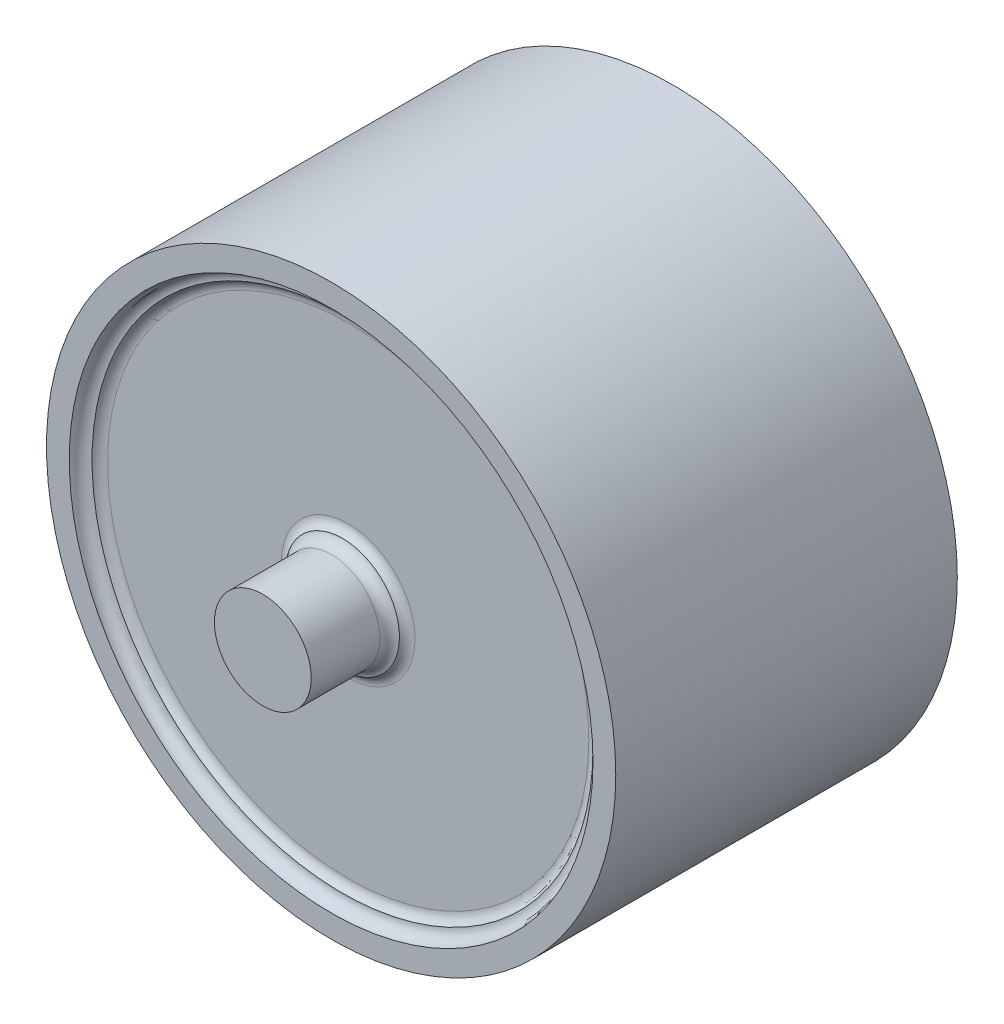
ISO-10303-21;
HEADER;
FILE_DESCRIPTION(('STEP AP214'),'2;1');
FILE_NAME('part.step','',(''),(''),'','','');
FILE_SCHEMA(('AUTOMOTIVE_DESIGN { 1 0 10303 214 1 1 1 1 }'));
ENDSEC;
DATA;
#1=APPLICATION_CONTEXT('core data for automotive mechanical design processes');
#2=APPLICATION_PROTOCOL_DEFINITION('international standard','automotive_design',2000,#1);
#3=PRODUCT_CONTEXT('',#1,'mechanical');
#4=PRODUCT('Part','Part','',(#3));
#5=PRODUCT_RELATED_PRODUCT_CATEGORY('part','',(#4));
#6=PRODUCT_DEFINITION_FORMATION('','',#4);
#7=PRODUCT_DEFINITION_CONTEXT('part definition',#1,'design');
#8=PRODUCT_DEFINITION('design','',#6,#7);
#9=PRODUCT_DEFINITION_SHAPE('','',#8);
#10=(LENGTH_UNIT() NAMED_UNIT(*) SI_UNIT(.MILLI.,.METRE.));
#11=(NAMED_UNIT(*) PLANE_ANGLE_UNIT() SI_UNIT($,.RADIAN.));
#12=(NAMED_UNIT(*) SI_UNIT($,.STERADIAN.) SOLID_ANGLE_UNIT());
#13=UNCERTAINTY_MEASURE_WITH_UNIT(LENGTH_MEASURE(1.E-05),#10,'distance_accuracy_value','');
#14=(GEOMETRIC_REPRESENTATION_CONTEXT(3) GLOBAL_UNCERTAINTY_ASSIGNED_CONTEXT((#13)) GLOBAL_UNIT_ASSIGNED_CONTEXT((#10,
#11,#12)) REPRESENTATION_CONTEXT('',''));
#15=CARTESIAN_POINT('',(0.,0.,0.));
#16=DIRECTION('',(0.,0.,1.));
#17=DIRECTION('',(1.,0.,0.));
#18=AXIS2_PLACEMENT_3D('',#15,#16,#17);
#19=CARTESIAN_POINT('',(0.,0.,-120.94205209168));
#20=DIRECTION('',(0.,0.,1.));
#21=DIRECTION('',(1.,0.,0.));
#22=AXIS2_PLACEMENT_3D('',#19,#20,#21);
#23=PLANE('',#22);
#24=CARTESIAN_POINT('',(0.,0.,-120.94205209168));
#25=DIRECTION('',(0.,0.,1.));
#26=DIRECTION('',(1.,0.,0.));
#27=AXIS2_PLACEMENT_3D('',#24,#25,#26);
#28=CIRCLE('',#27,200.);
#29=CARTESIAN_POINT('',(200.,0.,-120.94205209168));
#30=VERTEX_POINT('',#29);
#31=EDGE_CURVE('E60',#30,#30,#28,.T.);
#32=ORIENTED_EDGE('',*,*,#31,.F.);
#33=EDGE_LOOP('',(#32));
#34=FACE_BOUND('',#33,.T.);
#35=CARTESIAN_POINT('',(0.,0.,-120.94205209168));
#36=DIRECTION('',(0.,0.,1.));
#37=DIRECTION('',(1.,0.,0.));
#38=AXIS2_PLACEMENT_3D('',#35,#36,#37);
#39=CIRCLE('',#38,40.);
#40=CARTESIAN_POINT('',(40.,0.,-120.94205209168));
#41=VERTEX_POINT('',#40);
#42=EDGE_CURVE('E52',#41,#41,#39,.F.);
#43=ORIENTED_EDGE('',*,*,#42,.F.);
#44=EDGE_LOOP('',(#43));
#45=FACE_BOUND('',#44,.T.);
#46=ADVANCED_FACE('F40',(#34,#45),#23,.F.);
#47=CARTESIAN_POINT('',(0.,0.,107.05794790832));
#48=DIRECTION('',(0.,0.,1.));
#49=DIRECTION('',(1.,0.,0.));
#50=AXIS2_PLACEMENT_3D('',#47,#48,#49);
#51=PLANE('',#50);
#52=CARTESIAN_POINT('',(0.,0.,107.05794790832));
#53=DIRECTION('',(0.,0.,1.));
#54=DIRECTION('',(1.,0.,0.));
#55=AXIS2_PLACEMENT_3D('',#52,#53,#54);
#56=CIRCLE('',#55,46.9282032302755);
#57=CARTESIAN_POINT('',(46.9282032302755,0.,107.05794790832));
#58=VERTEX_POINT('',#57);
#59=EDGE_CURVE('E10',#58,#58,#56,.F.);
#60=ORIENTED_EDGE('',*,*,#59,.T.);
#61=EDGE_LOOP('',(#60));
#62=FACE_BOUND('',#61,.T.);
#63=CARTESIAN_POINT('',(0.,0.,107.05794790832));
#64=DIRECTION('',(0.,0.,1.));
#65=DIRECTION('',(1.,0.,0.));
#66=AXIS2_PLACEMENT_3D('',#63,#64,#65);
#67=CIRCLE('',#66,169.071796769725);
#68=CARTESIAN_POINT('',(169.071796769725,0.,107.05794790832));
#69=VERTEX_POINT('',#68);
#70=EDGE_CURVE('E57',#69,#69,#67,.T.);
#71=ORIENTED_EDGE('',*,*,#70,.T.);
#72=EDGE_LOOP('',(#71));
#73=FACE_BOUND('',#72,.T.);
#74=ADVANCED_FACE('F95',(#62,#73),#51,.T.);
#75=CARTESIAN_POINT('',(0.,0.,-120.94205209168));
#76=DIRECTION('',(0.,0.,1.));
#77=DIRECTION('',(1.,0.,0.));
#78=AXIS2_PLACEMENT_3D('',#75,#76,#77);
#79=CYLINDRICAL_SURFACE('',#78,200.);
#80=ORIENTED_EDGE('',*,*,#31,.T.);
#81=EDGE_LOOP('',(#80));
#82=FACE_BOUND('',#81,.T.);
#83=CARTESIAN_POINT('',(0.,0.,119.05794790832));
#84=DIRECTION('',(0.,0.,1.));
#85=DIRECTION('',(1.,0.,0.));
#86=AXIS2_PLACEMENT_3D('',#83,#84,#85);
#87=CIRCLE('',#86,200.);
#88=CARTESIAN_POINT('',(200.,0.,119.05794790832));
#89=VERTEX_POINT('',#88);
#90=EDGE_CURVE('E63',#89,#89,#87,.T.);
#91=ORIENTED_EDGE('',*,*,#90,.F.);
#92=EDGE_LOOP('',(#91));
#93=FACE_BOUND('',#92,.T.);
#94=ADVANCED_FACE('F101',(#82,#93),#79,.T.);
#95=CARTESIAN_POINT('',(0.,0.,119.05794790832));
#96=DIRECTION('',(0.,0.,1.));
#97=DIRECTION('',(1.,0.,0.));
#98=AXIS2_PLACEMENT_3D('',#95,#96,#97);
#99=PLANE('',#98);
#100=CARTESIAN_POINT('',(0.,0.,119.05794790832));
#101=DIRECTION('',(0.,0.,1.));
#102=DIRECTION('',(1.,0.,0.));
#103=AXIS2_PLACEMENT_3D('',#100,#101,#102);
#104=CIRCLE('',#103,184.);
#105=CARTESIAN_POINT('',(184.,0.,119.05794790832));
#106=VERTEX_POINT('',#105);
#107=EDGE_CURVE('E66',#106,#106,#104,.T.);
#108=ORIENTED_EDGE('',*,*,#107,.F.);
#109=EDGE_LOOP('',(#108));
#110=FACE_BOUND('',#109,.T.);
#111=ORIENTED_EDGE('',*,*,#90,.T.);
#112=EDGE_LOOP('',(#111));
#113=FACE_BOUND('',#112,.T.);
#114=ADVANCED_FACE('F107',(#110,#113),#99,.T.);
#115=CARTESIAN_POINT('',(0.,0.,119.05794790832));
#116=DIRECTION('',(0.,0.,1.));
#117=DIRECTION('',(1.,0.,0.));
#118=AXIS2_PLACEMENT_3D('',#115,#116,#117);
#119=TOROIDAL_SURFACE('',#118,176.,8.);
#120=ORIENTED_EDGE('',*,*,#107,.T.);
#121=EDGE_LOOP('',(#120));
#122=FACE_BOUND('',#121,.T.);
#123=CARTESIAN_POINT('',(0.,0.,111.05794790832));
#124=DIRECTION('',(0.,0.,1.));
#125=DIRECTION('',(1.,0.,0.));
#126=AXIS2_PLACEMENT_3D('',#123,#124,#125);
#127=CIRCLE('',#126,176.);
#128=CARTESIAN_POINT('',(176.,0.,111.05794790832));
#129=VERTEX_POINT('',#128);
#130=EDGE_CURVE('E69',#129,#129,#127,.T.);
#131=ORIENTED_EDGE('',*,*,#130,.F.);
#132=EDGE_LOOP('',(#131));
#133=FACE_BOUND('',#132,.T.);
#134=ADVANCED_FACE('F111',(#122,#133),#119,.F.);
#135=CARTESIAN_POINT('',(0.,0.,115.05794790832));
#136=DIRECTION('',(0.,0.,-1.));
#137=DIRECTION('',(-1.,0.,0.));
#138=AXIS2_PLACEMENT_3D('',#135,#136,#137);
#139=TOROIDAL_SURFACE('',#138,169.071796769725,8.);
#140=ORIENTED_EDGE('',*,*,#130,.T.);
#141=EDGE_LOOP('',(#140));
#142=FACE_BOUND('',#141,.T.);
#143=ORIENTED_EDGE('',*,*,#70,.F.);
#144=EDGE_LOOP('',(#143));
#145=FACE_BOUND('',#144,.T.);
#146=ADVANCED_FACE('F114',(#142,#145),#139,.F.);
#147=CARTESIAN_POINT('',(0.,0.,167.05794790832));
#148=DIRECTION('',(0.,0.,-1.));
#149=DIRECTION('',(-1.,0.,0.));
#150=AXIS2_PLACEMENT_3D('',#147,#148,#149);
#151=CYLINDRICAL_SURFACE('',#150,34.);
#152=CARTESIAN_POINT('',(0.,0.,118.803914600735));
#153=DIRECTION('',(0.,0.,-1.));
#154=DIRECTION('',(-1.,0.,0.));
#155=AXIS2_PLACEMENT_3D('',#152,#153,#154);
#156=CIRCLE('',#155,34.);
#157=CARTESIAN_POINT('',(-34.,0.,118.803914600735));
#158=VERTEX_POINT('',#157);
#159=EDGE_CURVE('E48',#158,#158,#156,.F.);
#160=ORIENTED_EDGE('',*,*,#159,.T.);
#161=EDGE_LOOP('',(#160));
#162=FACE_BOUND('',#161,.T.);
#163=CARTESIAN_POINT('',(0.,0.,167.05794790832));
#164=DIRECTION('',(0.,0.,1.));
#165=DIRECTION('',(1.,0.,0.));
#166=AXIS2_PLACEMENT_3D('',#163,#164,#165);
#167=CIRCLE('',#166,34.);
#168=CARTESIAN_POINT('',(34.,0.,167.05794790832));
#169=VERTEX_POINT('',#168);
#170=EDGE_CURVE('E72',#169,#169,#167,.T.);
#171=ORIENTED_EDGE('',*,*,#170,.F.);
#172=EDGE_LOOP('',(#171));
#173=FACE_BOUND('',#172,.T.);
#174=ADVANCED_FACE('F117',(#162,#173),#151,.T.);
#175=CARTESIAN_POINT('',(0.,0.,167.05794790832));
#176=DIRECTION('',(0.,0.,1.));
#177=DIRECTION('',(1.,0.,0.));
#178=AXIS2_PLACEMENT_3D('',#175,#176,#177);
#179=PLANE('',#178);
#180=ORIENTED_EDGE('',*,*,#170,.T.);
#181=EDGE_LOOP('',(#180));
#182=FACE_BOUND('',#181,.T.);
#183=ADVANCED_FACE('F122',(#182),#179,.T.);
#184=CARTESIAN_POINT('',(0.,0.,-124.94205209168));
#185=DIRECTION('',(0.,0.,1.));
#186=DIRECTION('',(1.,0.,0.));
#187=AXIS2_PLACEMENT_3D('',#184,#185,#186);
#188=CYLINDRICAL_SURFACE('',#187,40.);
#189=CARTESIAN_POINT('',(0.,0.,-124.94205209168));
#190=DIRECTION('',(0.,0.,-1.));
#191=DIRECTION('',(-1.,0.,0.));
#192=AXIS2_PLACEMENT_3D('',#189,#190,#191);
#193=CIRCLE('',#192,40.);
#194=CARTESIAN_POINT('',(-40.,0.,-124.94205209168));
#195=VERTEX_POINT('',#194);
#196=EDGE_CURVE('E75',#195,#195,#193,.T.);
#197=ORIENTED_EDGE('',*,*,#196,.F.);
#198=EDGE_LOOP('',(#197));
#199=FACE_BOUND('',#198,.T.);
#200=ORIENTED_EDGE('',*,*,#42,.T.);
#201=EDGE_LOOP('',(#200));
#202=FACE_BOUND('',#201,.T.);
#203=ADVANCED_FACE('F92',(#199,#202),#188,.T.);
#204=CARTESIAN_POINT('',(0.,0.,-124.94205209168));
#205=DIRECTION('',(0.,0.,-1.));
#206=DIRECTION('',(-1.,0.,0.));
#207=AXIS2_PLACEMENT_3D('',#204,#205,#206);
#208=PLANE('',#207);
#209=ORIENTED_EDGE('',*,*,#196,.T.);
#210=EDGE_LOOP('',(#209));
#211=FACE_BOUND('',#210,.T.);
#212=ADVANCED_FACE('F86',(#211),#208,.T.);
#213=CARTESIAN_POINT('',(0.,0.,115.05794790832));
#214=DIRECTION('',(0.,0.,1.));
#215=DIRECTION('',(1.,0.,0.));
#216=AXIS2_PLACEMENT_3D('',#213,#214,#215);
#217=TOROIDAL_SURFACE('',#216,46.9282032302755,8.);
#218=ORIENTED_EDGE('',*,*,#59,.F.);
#219=EDGE_LOOP('',(#218));
#220=FACE_BOUND('',#219,.T.);
#221=CARTESIAN_POINT('',(0.,0.,111.05794790832));
#222=DIRECTION('',(0.,0.,1.));
#223=DIRECTION('',(1.,0.,0.));
#224=AXIS2_PLACEMENT_3D('',#221,#222,#223);
#225=CIRCLE('',#224,40.);
#226=CARTESIAN_POINT('',(40.,0.,111.05794790832));
#227=VERTEX_POINT('',#226);
#228=EDGE_CURVE('E44',#227,#227,#225,.T.);
#229=ORIENTED_EDGE('',*,*,#228,.F.);
#230=EDGE_LOOP('',(#229));
#231=FACE_BOUND('',#230,.T.);
#232=ADVANCED_FACE('F42',(#220,#231),#217,.F.);
#233=CARTESIAN_POINT('',(0.,0.,118.803914600735));
#234=DIRECTION('',(0.,0.,-1.));
#235=DIRECTION('',(-1.,0.,0.));
#236=AXIS2_PLACEMENT_3D('',#233,#234,#235);
#237=TOROIDAL_SURFACE('',#236,42.,8.);
#238=ORIENTED_EDGE('',*,*,#228,.T.);
#239=EDGE_LOOP('',(#238));
#240=FACE_BOUND('',#239,.T.);
#241=ORIENTED_EDGE('',*,*,#159,.F.);
#242=EDGE_LOOP('',(#241));
#243=FACE_BOUND('',#242,.T.);
#244=ADVANCED_FACE('F82',(#240,#243),#237,.F.);
#245=CLOSED_SHELL('',(#46,#74,#94,#114,#134,#146,#174,#183,#203,#212,#232,#244));
#246=MANIFOLD_SOLID_BREP('B2',#245);
#247=ADVANCED_BREP_SHAPE_REPRESENTATION('',(#18,#246),#14);
#248=SHAPE_DEFINITION_REPRESENTATION(#9,#247);
ENDSEC;
END-ISO-10303-21;
